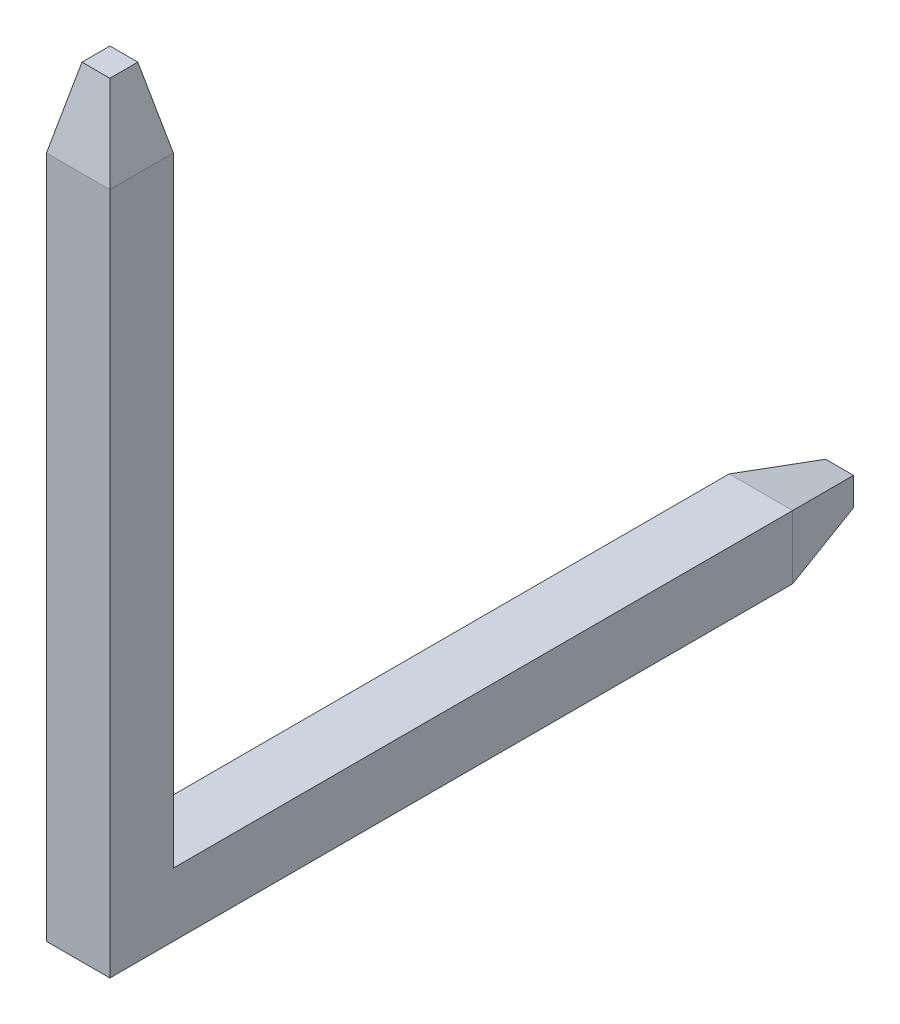
ISO-10303-21;
HEADER;
FILE_DESCRIPTION(('STEP AP214'),'2;1');
FILE_NAME('part.step','',(''),(''),'','','');
FILE_SCHEMA(('AUTOMOTIVE_DESIGN { 1 0 10303 214 1 1 1 1 }'));
ENDSEC;
DATA;
#1=APPLICATION_CONTEXT('core data for automotive mechanical design processes');
#2=APPLICATION_PROTOCOL_DEFINITION('international standard','automotive_design',2000,#1);
#3=PRODUCT_CONTEXT('',#1,'mechanical');
#4=PRODUCT('Part','Part','',(#3));
#5=PRODUCT_RELATED_PRODUCT_CATEGORY('part','',(#4));
#6=PRODUCT_DEFINITION_FORMATION('','',#4);
#7=PRODUCT_DEFINITION_CONTEXT('part definition',#1,'design');
#8=PRODUCT_DEFINITION('design','',#6,#7);
#9=PRODUCT_DEFINITION_SHAPE('','',#8);
#10=(LENGTH_UNIT() NAMED_UNIT(*) SI_UNIT(.MILLI.,.METRE.));
#11=(NAMED_UNIT(*) PLANE_ANGLE_UNIT() SI_UNIT($,.RADIAN.));
#12=(NAMED_UNIT(*) SI_UNIT($,.STERADIAN.) SOLID_ANGLE_UNIT());
#13=UNCERTAINTY_MEASURE_WITH_UNIT(LENGTH_MEASURE(1.E-05),#10,'distance_accuracy_value','');
#14=(GEOMETRIC_REPRESENTATION_CONTEXT(3) GLOBAL_UNCERTAINTY_ASSIGNED_CONTEXT((#13)) GLOBAL_UNIT_ASSIGNED_CONTEXT((#10,
#11,#12)) REPRESENTATION_CONTEXT('',''));
#15=CARTESIAN_POINT('',(0.,0.,0.));
#16=DIRECTION('',(0.,0.,1.));
#17=DIRECTION('',(1.,0.,0.));
#18=AXIS2_PLACEMENT_3D('',#15,#16,#17);
#19=CARTESIAN_POINT('',(63.2586997101443,61.9091854408772,-0.2310394819826));
#20=DIRECTION('',(0.975441002067707,1.54889974210962E-10,-0.220260871434643));
#21=DIRECTION('',(-0.220260871434643,0.,-0.975441002067707));
#22=AXIS2_PLACEMENT_3D('',#19,#20,#21);
#23=PLANE('',#22);
#24=DIRECTION('',(0.215104779259748,0.215104779593885,0.952606879953888));
#25=VECTOR('',#24,1.);
#26=CARTESIAN_POINT('',(63.2586997100498,62.3701954408718,-0.231039482101166));
#27=LINE('',#26,#25);
#28=CARTESIAN_POINT('',(63.2586997100542,62.3701954408237,-0.231039482063525));
#29=VERTEX_POINT('',#28);
#30=CARTESIAN_POINT('',(63.4364997100594,62.547995441398,0.556360518249975));
#31=VERTEX_POINT('',#30);
#32=EDGE_CURVE('E121',#29,#31,#27,.T.);
#33=ORIENTED_EDGE('',*,*,#32,.T.);
#34=DIRECTION('',(2.05103367282991E-10,-1.,0.));
#35=VECTOR('',#34,1.);
#36=CARTESIAN_POINT('',(63.4364997087422,68.7455954410752,0.556360518257581));
#37=LINE('',#36,#35);
#38=CARTESIAN_POINT('',(63.4364997101687,61.9129954411439,0.556360518183418));
#39=VERTEX_POINT('',#38);
#40=EDGE_CURVE('E128',#31,#39,#37,.T.);
#41=ORIENTED_EDGE('',*,*,#40,.T.);
#42=DIRECTION('',(-0.21510477937485,0.21510477911358,-0.952606880036353));
#43=VECTOR('',#42,1.);
#44=CARTESIAN_POINT('',(63.4364997101632,61.9129954410425,0.55636051816138));
#45=LINE('',#44,#43);
#46=CARTESIAN_POINT('',(63.2586997100927,62.0907954409624,-0.231039482025847));
#47=VERTEX_POINT('',#46);
#48=EDGE_CURVE('E123',#39,#47,#45,.T.);
#49=ORIENTED_EDGE('',*,*,#48,.T.);
#50=DIRECTION('',(0.,1.,-2.05103428515331E-10));
#51=VECTOR('',#50,1.);
#52=CARTESIAN_POINT('',(63.2586997100498,62.3701954408772,-0.231039482077156));
#53=LINE('',#52,#51);
#54=EDGE_CURVE('E90',#29,#47,#53,.F.);
#55=ORIENTED_EDGE('',*,*,#54,.F.);
#56=EDGE_LOOP('',(#33,#41,#49,#55));
#57=FACE_BOUND('',#56,.T.);
#58=ADVANCED_FACE('F17',(#57),#23,.T.);
#59=CARTESIAN_POINT('',(63.2586997085807,69.5329954423091,6.75015051645373));
#60=DIRECTION('',(0.97544100202253,0.22026087163471,-4.51762598990199E-11));
#61=DIRECTION('',(-0.22026087163471,0.97544100202253,0.));
#62=AXIS2_PLACEMENT_3D('',#59,#60,#61);
#63=PLANE('',#62);
#64=DIRECTION('',(0.215104779548421,-0.952606879899204,0.215104779547385));
#65=VECTOR('',#64,1.);
#66=CARTESIAN_POINT('',(63.2586997085807,69.5329954424024,7.21116051645401));
#67=LINE('',#66,#65);
#68=CARTESIAN_POINT('',(63.2586997085869,69.5329954423761,7.21116051646402));
#69=VERTEX_POINT('',#68);
#70=CARTESIAN_POINT('',(63.4364997089163,68.7455954424847,7.38896051696777));
#71=VERTEX_POINT('',#70);
#72=EDGE_CURVE('E131',#69,#71,#67,.T.);
#73=ORIENTED_EDGE('',*,*,#72,.T.);
#74=DIRECTION('',(0.,0.,1.));
#75=VECTOR('',#74,1.);
#76=CARTESIAN_POINT('',(63.4364997087422,68.745595442485,0.55636051661523));
#77=LINE('',#76,#75);
#78=CARTESIAN_POINT('',(63.4364997087361,68.7455954423677,6.75396051659124));
#79=VERTEX_POINT('',#78);
#80=EDGE_CURVE('E100',#71,#79,#77,.F.);
#81=ORIENTED_EDGE('',*,*,#80,.T.);
#82=DIRECTION('',(-0.215104779521719,0.952606879993178,0.215104779157915));
#83=VECTOR('',#82,1.);
#84=CARTESIAN_POINT('',(63.4364997087634,68.7455954421525,6.75396051657146));
#85=LINE('',#84,#83);
#86=CARTESIAN_POINT('',(63.2586997085807,69.532995442346,6.9317605164496));
#87=VERTEX_POINT('',#86);
#88=EDGE_CURVE('E95',#79,#87,#85,.T.);
#89=ORIENTED_EDGE('',*,*,#88,.T.);
#90=DIRECTION('',(0.,2.05103428515331E-10,1.));
#91=VECTOR('',#90,1.);
#92=CARTESIAN_POINT('',(63.2586997085807,69.5329954423463,6.93176051645373));
#93=LINE('',#92,#91);
#94=EDGE_CURVE('E20',#69,#87,#93,.F.);
#95=ORIENTED_EDGE('',*,*,#94,.F.);
#96=EDGE_LOOP('',(#73,#81,#89,#95));
#97=FACE_BOUND('',#96,.T.);
#98=ADVANCED_FACE('F97',(#97),#63,.T.);
#99=CARTESIAN_POINT('',(63.2586997085807,69.5329954423463,6.93176051645373));
#100=DIRECTION('',(-2.05103367282991E-10,1.,-2.05103428515331E-10));
#101=DIRECTION('',(0.,2.05103428515331E-10,1.));
#102=AXIS2_PLACEMENT_3D('',#99,#100,#101);
#103=PLANE('',#102);
#104=ORIENTED_EDGE('',*,*,#94,.T.);
#105=DIRECTION('',(1.,9.95055938476169E-12,-4.40667630317264E-11));
#106=VECTOR('',#105,1.);
#107=CARTESIAN_POINT('',(63.4403097085807,69.5329954423469,6.93176051644545));
#108=LINE('',#107,#106);
#109=CARTESIAN_POINT('',(62.9792997085825,69.5329954423154,6.93176051645839));
#110=VERTEX_POINT('',#109);
#111=EDGE_CURVE('E105',#87,#110,#108,.F.);
#112=ORIENTED_EDGE('',*,*,#111,.T.);
#113=DIRECTION('',(-4.4066776227612E-11,9.95056236447781E-12,1.));
#114=VECTOR('',#113,1.);
#115=CARTESIAN_POINT('',(62.9792997085601,69.5329954422924,7.39277051661523));
#116=LINE('',#115,#114);
#117=CARTESIAN_POINT('',(62.9792997085762,69.5329954423318,7.21116051645972));
#118=VERTEX_POINT('',#117);
#119=EDGE_CURVE('E136',#110,#118,#116,.T.);
#120=ORIENTED_EDGE('',*,*,#119,.T.);
#121=DIRECTION('',(1.,9.95055942091471E-12,4.40667631076977E-11));
#122=VECTOR('',#121,1.);
#123=CARTESIAN_POINT('',(63.4403097087422,69.5329954423497,7.21116051647432));
#124=LINE('',#123,#122);
#125=EDGE_CURVE('E110',#118,#69,#124,.T.);
#126=ORIENTED_EDGE('',*,*,#125,.T.);
#127=EDGE_LOOP('',(#104,#112,#120,#126));
#128=FACE_BOUND('',#127,.T.);
#129=ADVANCED_FACE('F107',(#128),#103,.T.);
#130=CARTESIAN_POINT('',(63.4403097085807,69.5329954423836,6.93176051645373));
#131=DIRECTION('',(4.51762463708971E-11,-0.220260871234577,0.975441002112883));
#132=DIRECTION('',(0.,-0.975441002112883,-0.220260871234577));
#133=AXIS2_PLACEMENT_3D('',#130,#131,#132);
#134=PLANE('',#133);
#135=DIRECTION('',(0.215104779155316,0.95260688006989,0.215104779184595));
#136=VECTOR('',#135,1.);
#137=CARTESIAN_POINT('',(62.8014997087006,68.7455954420318,6.75396051654969));
#138=LINE('',#137,#136);
#139=CARTESIAN_POINT('',(62.8014997088961,68.7455954421465,6.75396051658673));
#140=VERTEX_POINT('',#139);
#141=EDGE_CURVE('E114',#140,#110,#138,.T.);
#142=ORIENTED_EDGE('',*,*,#141,.T.);
#143=ORIENTED_EDGE('',*,*,#111,.F.);
#144=ORIENTED_EDGE('',*,*,#88,.F.);
#145=DIRECTION('',(1.,0.,0.));
#146=VECTOR('',#145,1.);
#147=CARTESIAN_POINT('',(63.4364997087422,68.7455954420281,6.75396051661523));
#148=LINE('',#147,#146);
#149=EDGE_CURVE('E140',#140,#79,#148,.T.);
#150=ORIENTED_EDGE('',*,*,#149,.F.);
#151=EDGE_LOOP('',(#142,#143,#144,#150));
#152=FACE_BOUND('',#151,.T.);
#153=ADVANCED_FACE('F112',(#152),#134,.F.);
#154=CARTESIAN_POINT('',(63.2586997100498,62.3701954408772,-0.231039482077156));
#155=DIRECTION('',(0.,-2.05103428515331E-10,-1.));
#156=DIRECTION('',(0.,1.,-2.05103428515331E-10));
#157=AXIS2_PLACEMENT_3D('',#154,#155,#156);
#158=PLANE('',#157);
#159=DIRECTION('',(1.,1.95152807862077E-10,-4.40667631076975E-11));
#160=VECTOR('',#159,1.);
#161=CARTESIAN_POINT('',(63.4403097100133,62.3701954409099,-0.231039482097483));
#162=LINE('',#161,#160);
#163=CARTESIAN_POINT('',(62.9792997100719,62.3701954408223,-0.231039482066318));
#164=VERTEX_POINT('',#163);
#165=EDGE_CURVE('E117',#164,#29,#162,.T.);
#166=ORIENTED_EDGE('',*,*,#165,.T.);
#167=ORIENTED_EDGE('',*,*,#54,.T.);
#168=DIRECTION('',(1.,1.9515280789823E-10,4.40667630317264E-11));
#169=VECTOR('',#168,1.);
#170=CARTESIAN_POINT('',(63.4403097101071,62.0907954409181,-0.231039482035856));
#171=LINE('',#170,#169);
#172=CARTESIAN_POINT('',(62.9792997101071,62.0907954408663,-0.231039482037722));
#173=VERTEX_POINT('',#172);
#174=EDGE_CURVE('E125',#47,#173,#171,.F.);
#175=ORIENTED_EDGE('',*,*,#174,.T.);
#176=DIRECTION('',(-2.39219584105724E-10,1.,-5.4017325443228E-11));
#177=VECTOR('',#176,1.);
#178=CARTESIAN_POINT('',(62.9792997099965,62.5518054409449,-0.2310394820436));
#179=LINE('',#178,#177);
#180=EDGE_CURVE('E154',#173,#164,#179,.T.);
#181=ORIENTED_EDGE('',*,*,#180,.T.);
#182=EDGE_LOOP('',(#166,#167,#175,#181));
#183=FACE_BOUND('',#182,.T.);
#184=ADVANCED_FACE('F200',(#183),#158,.T.);
#185=CARTESIAN_POINT('',(63.4403097100133,62.547995441076,0.556360517886379));
#186=DIRECTION('',(2.00066234100716E-10,-0.97544100202253,0.220260871634709));
#187=DIRECTION('',(0.,-0.220260871634709,-0.97544100202253));
#188=AXIS2_PLACEMENT_3D('',#185,#186,#187);
#189=PLANE('',#188);
#190=ORIENTED_EDGE('',*,*,#32,.F.);
#191=ORIENTED_EDGE('',*,*,#165,.F.);
#192=DIRECTION('',(-0.215104779394808,0.215104779531273,0.952606879937529));
#193=VECTOR('',#192,1.);
#194=CARTESIAN_POINT('',(62.9792997100495,62.3701954408199,-0.231039482076006));
#195=LINE('',#194,#193);
#196=CARTESIAN_POINT('',(62.8014997099689,62.5479954411599,0.556360518212876));
#197=VERTEX_POINT('',#196);
#198=EDGE_CURVE('E156',#164,#197,#195,.T.);
#199=ORIENTED_EDGE('',*,*,#198,.T.);
#200=DIRECTION('',(1.,2.05103367282991E-10,0.));
#201=VECTOR('',#200,1.);
#202=CARTESIAN_POINT('',(63.4364997100133,62.5479954410751,0.556360518257581));
#203=LINE('',#202,#201);
#204=EDGE_CURVE('E148',#31,#197,#203,.F.);
#205=ORIENTED_EDGE('',*,*,#204,.F.);
#206=EDGE_LOOP('',(#190,#191,#199,#205));
#207=FACE_BOUND('',#206,.T.);
#208=ADVANCED_FACE('F203',(#207),#189,.F.);
#209=CARTESIAN_POINT('',(63.4403097101071,62.0907954409145,-0.231039482019849));
#210=DIRECTION('',(-2.00066234119248E-10,0.975441002112883,0.220260871234577));
#211=DIRECTION('',(0.,-0.220260871234577,0.975441002112883));
#212=AXIS2_PLACEMENT_3D('',#209,#210,#211);
#213=PLANE('',#212);
#214=ORIENTED_EDGE('',*,*,#48,.F.);
#215=DIRECTION('',(1.,2.05103367282991E-10,0.));
#216=VECTOR('',#215,1.);
#217=CARTESIAN_POINT('',(63.4364997101436,61.9129954410752,0.556360518008166));
#218=LINE('',#217,#216);
#219=CARTESIAN_POINT('',(62.8014997101362,61.9129954409409,0.556360518040732));
#220=VERTEX_POINT('',#219);
#221=EDGE_CURVE('E160',#220,#39,#218,.T.);
#222=ORIENTED_EDGE('',*,*,#221,.F.);
#223=DIRECTION('',(0.215104779307887,0.215104779201802,-0.952606880031553));
#224=VECTOR('',#223,1.);
#225=CARTESIAN_POINT('',(62.8014997101451,61.9129954409459,0.556360518009589));
#226=LINE('',#225,#224);
#227=EDGE_CURVE('E151',#220,#173,#226,.T.);
#228=ORIENTED_EDGE('',*,*,#227,.T.);
#229=ORIENTED_EDGE('',*,*,#174,.F.);
#230=EDGE_LOOP('',(#214,#222,#228,#229));
#231=FACE_BOUND('',#230,.T.);
#232=ADVANCED_FACE('F192',(#231),#213,.F.);
#233=CARTESIAN_POINT('',(63.4364997087422,68.7455954410752,0.55636051661523));
#234=DIRECTION('',(-1.,-2.05103367282991E-10,0.));
#235=DIRECTION('',(2.05103367282991E-10,-1.,0.));
#236=AXIS2_PLACEMENT_3D('',#233,#234,#235);
#237=PLANE('',#236);
#238=DIRECTION('',(0.,2.05103428515331E-10,1.));
#239=VECTOR('',#238,1.);
#240=CARTESIAN_POINT('',(63.4364997100133,62.5479954423463,6.75396051788638));
#241=LINE('',#240,#239);
#242=CARTESIAN_POINT('',(63.4364997093884,62.5479954423797,6.75396051754057));
#243=VERTEX_POINT('',#242);
#244=EDGE_CURVE('E145',#243,#31,#241,.F.);
#245=ORIENTED_EDGE('',*,*,#244,.F.);
#246=DIRECTION('',(0.,1.,-2.05103428515331E-10));
#247=VECTOR('',#246,1.);
#248=CARTESIAN_POINT('',(63.4364997087634,68.7455954423463,6.75396051661523));
#249=LINE('',#248,#247);
#250=EDGE_CURVE('E138',#79,#243,#249,.F.);
#251=ORIENTED_EDGE('',*,*,#250,.F.);
#252=ORIENTED_EDGE('',*,*,#80,.F.);
#253=DIRECTION('',(0.,-1.,2.05103428515331E-10));
#254=VECTOR('',#253,1.);
#255=CARTESIAN_POINT('',(63.4364997101436,61.9129954424766,7.38896051801662));
#256=LINE('',#255,#254);
#257=CARTESIAN_POINT('',(63.4364997101534,61.9129954421183,7.38896051801662));
#258=VERTEX_POINT('',#257);
#259=EDGE_CURVE('E164',#258,#71,#256,.F.);
#260=ORIENTED_EDGE('',*,*,#259,.F.);
#261=DIRECTION('',(0.,-2.05103428515331E-10,-1.));
#262=VECTOR('',#261,1.);
#263=CARTESIAN_POINT('',(63.4364997101632,61.9129954410752,0.55636051801662));
#264=LINE('',#263,#262);
#265=EDGE_CURVE('E158',#39,#258,#264,.F.);
#266=ORIENTED_EDGE('',*,*,#265,.F.);
#267=ORIENTED_EDGE('',*,*,#40,.F.);
#268=EDGE_LOOP('',(#245,#251,#252,#260,#266,#267));
#269=FACE_BOUND('',#268,.T.);
#270=ADVANCED_FACE('F208',(#269),#237,.F.);
#271=CARTESIAN_POINT('',(63.4403097087422,68.7455954424774,7.38896051661523));
#272=DIRECTION('',(4.51762464529657E-11,-0.22026087163471,-0.97544100202253));
#273=DIRECTION('',(0.,0.97544100202253,-0.22026087163471));
#274=AXIS2_PLACEMENT_3D('',#271,#272,#273);
#275=PLANE('',#274);
#276=ORIENTED_EDGE('',*,*,#72,.F.);
#277=ORIENTED_EDGE('',*,*,#125,.F.);
#278=DIRECTION('',(-0.215104779156616,-0.952606879987345,0.215104779548849));
#279=VECTOR('',#278,1.);
#280=CARTESIAN_POINT('',(62.9792997085807,69.5329954423463,7.21116051645915));
#281=LINE('',#280,#279);
#282=CARTESIAN_POINT('',(62.8014997087572,68.7455954424322,7.38896051677682));
#283=VERTEX_POINT('',#282);
#284=EDGE_CURVE('E133',#118,#283,#281,.T.);
#285=ORIENTED_EDGE('',*,*,#284,.T.);
#286=DIRECTION('',(1.,0.,0.));
#287=VECTOR('',#286,1.);
#288=CARTESIAN_POINT('',(63.4364997101436,68.745595442485,7.38896051661523));
#289=LINE('',#288,#287);
#290=EDGE_CURVE('E167',#71,#283,#289,.F.);
#291=ORIENTED_EDGE('',*,*,#290,.F.);
#292=EDGE_LOOP('',(#276,#277,#285,#291));
#293=FACE_BOUND('',#292,.T.);
#294=ADVANCED_FACE('F213',(#293),#275,.F.);
#295=CARTESIAN_POINT('',(62.8014997087422,68.7455954423471,7.39277051661523));
#296=DIRECTION('',(0.975441002112883,-0.220260871234577,4.51762598990199E-11));
#297=DIRECTION('',(0.220260871234577,0.975441002112883,0.));
#298=AXIS2_PLACEMENT_3D('',#295,#296,#297);
#299=PLANE('',#298);
#300=ORIENTED_EDGE('',*,*,#141,.F.);
#301=DIRECTION('',(0.,0.,1.));
#302=VECTOR('',#301,1.);
#303=CARTESIAN_POINT('',(62.8014997087422,68.7455954423548,0.55636051661523));
#304=LINE('',#303,#302);
#305=EDGE_CURVE('E170',#283,#140,#304,.F.);
#306=ORIENTED_EDGE('',*,*,#305,.F.);
#307=ORIENTED_EDGE('',*,*,#284,.F.);
#308=ORIENTED_EDGE('',*,*,#119,.F.);
#309=EDGE_LOOP('',(#300,#306,#307,#308));
#310=FACE_BOUND('',#309,.T.);
#311=ADVANCED_FACE('F217',(#310),#299,.F.);
#312=CARTESIAN_POINT('',(63.4364997087422,68.7455954423463,6.75396051661523));
#313=DIRECTION('',(0.,-2.05103428515331E-10,-1.));
#314=DIRECTION('',(0.,1.,-2.05103428515331E-10));
#315=AXIS2_PLACEMENT_3D('',#312,#313,#314);
#316=PLANE('',#315);
#317=DIRECTION('',(2.05103367282991E-10,-1.,0.));
#318=VECTOR('',#317,1.);
#319=CARTESIAN_POINT('',(62.8014997087422,68.745595440945,6.75396051654969));
#320=LINE('',#319,#318);
#321=CARTESIAN_POINT('',(62.8014997100071,62.5479954423146,6.75396051754109));
#322=VERTEX_POINT('',#321);
#323=EDGE_CURVE('E173',#140,#322,#320,.T.);
#324=ORIENTED_EDGE('',*,*,#323,.F.);
#325=ORIENTED_EDGE('',*,*,#149,.T.);
#326=ORIENTED_EDGE('',*,*,#250,.T.);
#327=DIRECTION('',(1.,2.05103367282991E-10,0.));
#328=VECTOR('',#327,1.);
#329=CARTESIAN_POINT('',(63.4364997100133,62.5479954423463,6.75396051784193));
#330=LINE('',#329,#328);
#331=EDGE_CURVE('E142',#322,#243,#330,.T.);
#332=ORIENTED_EDGE('',*,*,#331,.F.);
#333=EDGE_LOOP('',(#324,#325,#326,#332));
#334=FACE_BOUND('',#333,.T.);
#335=ADVANCED_FACE('F221',(#334),#316,.T.);
#336=CARTESIAN_POINT('',(63.4364997100133,62.5479954423463,6.75396051788638));
#337=DIRECTION('',(-2.05103367282991E-10,1.,-2.05103428515331E-10));
#338=DIRECTION('',(0.,2.05103428515331E-10,1.));
#339=AXIS2_PLACEMENT_3D('',#336,#337,#338);
#340=PLANE('',#339);
#341=ORIENTED_EDGE('',*,*,#244,.T.);
#342=ORIENTED_EDGE('',*,*,#204,.T.);
#343=DIRECTION('',(0.,0.,1.));
#344=VECTOR('',#343,1.);
#345=CARTESIAN_POINT('',(62.8014997100134,62.5479954422606,0.55636051661523));
#346=LINE('',#345,#344);
#347=EDGE_CURVE('E176',#322,#197,#346,.F.);
#348=ORIENTED_EDGE('',*,*,#347,.F.);
#349=ORIENTED_EDGE('',*,*,#331,.T.);
#350=EDGE_LOOP('',(#341,#342,#348,#349));
#351=FACE_BOUND('',#350,.T.);
#352=ADVANCED_FACE('F223',(#351),#340,.T.);
#353=CARTESIAN_POINT('',(62.8014997100125,62.5518054409449,0.556360517885597));
#354=DIRECTION('',(0.975441002067707,2.45242494009002E-10,0.220260871434643));
#355=DIRECTION('',(0.220260871434643,0.,-0.975441002067707));
#356=AXIS2_PLACEMENT_3D('',#353,#354,#355);
#357=PLANE('',#356);
#358=ORIENTED_EDGE('',*,*,#198,.F.);
#359=ORIENTED_EDGE('',*,*,#180,.F.);
#360=ORIENTED_EDGE('',*,*,#227,.F.);
#361=DIRECTION('',(2.05103367282991E-10,-1.,0.));
#362=VECTOR('',#361,1.);
#363=CARTESIAN_POINT('',(62.8014997087422,68.745595440945,0.556360518074363));
#364=LINE('',#363,#362);
#365=EDGE_CURVE('E179',#197,#220,#364,.T.);
#366=ORIENTED_EDGE('',*,*,#365,.F.);
#367=EDGE_LOOP('',(#358,#359,#360,#366));
#368=FACE_BOUND('',#367,.T.);
#369=ADVANCED_FACE('F197',(#368),#357,.F.);
#370=CARTESIAN_POINT('',(63.4364997101436,61.9129954410752,0.55636051801662));
#371=DIRECTION('',(2.05103367282991E-10,-1.,2.05103428515331E-10));
#372=DIRECTION('',(0.,-2.05103428515331E-10,-1.));
#373=AXIS2_PLACEMENT_3D('',#370,#371,#372);
#374=PLANE('',#373);
#375=DIRECTION('',(0.,0.,1.));
#376=VECTOR('',#375,1.);
#377=CARTESIAN_POINT('',(62.8014997101436,61.9129954409459,0.55636051661523));
#378=LINE('',#377,#376);
#379=CARTESIAN_POINT('',(62.8014997097934,61.9129954419962,7.38896051801662));
#380=VERTEX_POINT('',#379);
#381=EDGE_CURVE('E26',#220,#380,#378,.T.);
#382=ORIENTED_EDGE('',*,*,#381,.F.);
#383=ORIENTED_EDGE('',*,*,#221,.T.);
#384=ORIENTED_EDGE('',*,*,#265,.T.);
#385=DIRECTION('',(1.,0.,0.));
#386=VECTOR('',#385,1.);
#387=CARTESIAN_POINT('',(63.4364997101436,61.9129954423463,7.38896051801662));
#388=LINE('',#387,#386);
#389=EDGE_CURVE('E35',#380,#258,#388,.T.);
#390=ORIENTED_EDGE('',*,*,#389,.F.);
#391=EDGE_LOOP('',(#382,#383,#384,#390));
#392=FACE_BOUND('',#391,.T.);
#393=ADVANCED_FACE('F186',(#392),#374,.T.);
#394=CARTESIAN_POINT('',(63.4364997101436,61.9129954424766,7.38896051801662));
#395=DIRECTION('',(0.,2.05103428515331E-10,1.));
#396=DIRECTION('',(0.,-1.,2.05103428515331E-10));
#397=AXIS2_PLACEMENT_3D('',#394,#395,#396);
#398=PLANE('',#397);
#399=ORIENTED_EDGE('',*,*,#259,.T.);
#400=ORIENTED_EDGE('',*,*,#290,.T.);
#401=DIRECTION('',(2.05103367282991E-10,-1.,0.));
#402=VECTOR('',#401,1.);
#403=CARTESIAN_POINT('',(62.8014997087422,68.745595440945,7.38896051801662));
#404=LINE('',#403,#402);
#405=EDGE_CURVE('E11',#380,#283,#404,.F.);
#406=ORIENTED_EDGE('',*,*,#405,.F.);
#407=ORIENTED_EDGE('',*,*,#389,.T.);
#408=EDGE_LOOP('',(#399,#400,#406,#407));
#409=FACE_BOUND('',#408,.T.);
#410=ADVANCED_FACE('F211',(#409),#398,.T.);
#411=CARTESIAN_POINT('',(62.8014997087422,68.745595440945,0.55636051661523));
#412=DIRECTION('',(-1.,-2.05103367282991E-10,0.));
#413=DIRECTION('',(2.05103367282991E-10,-1.,0.));
#414=AXIS2_PLACEMENT_3D('',#411,#412,#413);
#415=PLANE('',#414);
#416=ORIENTED_EDGE('',*,*,#381,.T.);
#417=ORIENTED_EDGE('',*,*,#405,.T.);
#418=ORIENTED_EDGE('',*,*,#305,.T.);
#419=ORIENTED_EDGE('',*,*,#323,.T.);
#420=ORIENTED_EDGE('',*,*,#347,.T.);
#421=ORIENTED_EDGE('',*,*,#365,.T.);
#422=EDGE_LOOP('',(#416,#417,#418,#419,#420,#421));
#423=FACE_BOUND('',#422,.T.);
#424=ADVANCED_FACE('F184',(#423),#415,.T.);
#425=CLOSED_SHELL('',(#58,#98,#129,#153,#184,#208,#232,#270,#294,#311,#335,#352,#369,#393,#410,#424));
#426=MANIFOLD_SOLID_BREP('B1',#425);
#427=ADVANCED_BREP_SHAPE_REPRESENTATION('',(#18,#426),#14);
#428=SHAPE_DEFINITION_REPRESENTATION(#9,#427);
ENDSEC;
END-ISO-10303-21;
